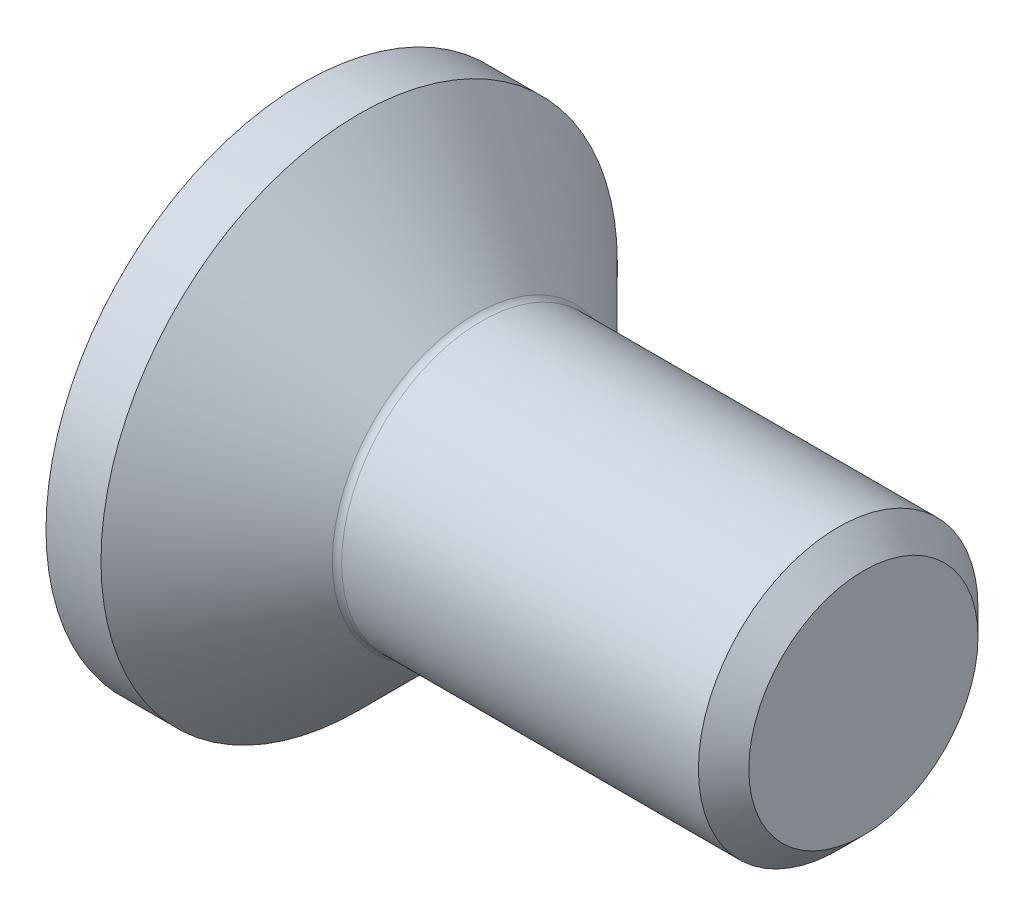
ISO-10303-21;
HEADER;
FILE_DESCRIPTION(('STEP AP214'),'2;1');
FILE_NAME('part.step','',(''),(''),'','','');
FILE_SCHEMA(('AUTOMOTIVE_DESIGN { 1 0 10303 214 1 1 1 1 }'));
ENDSEC;
DATA;
#1=APPLICATION_CONTEXT('core data for automotive mechanical design processes');
#2=APPLICATION_PROTOCOL_DEFINITION('international standard','automotive_design',2000,#1);
#3=PRODUCT_CONTEXT('',#1,'mechanical');
#4=PRODUCT('Part','Part','',(#3));
#5=PRODUCT_RELATED_PRODUCT_CATEGORY('part','',(#4));
#6=PRODUCT_DEFINITION_FORMATION('','',#4);
#7=PRODUCT_DEFINITION_CONTEXT('part definition',#1,'design');
#8=PRODUCT_DEFINITION('design','',#6,#7);
#9=PRODUCT_DEFINITION_SHAPE('','',#8);
#10=(LENGTH_UNIT() NAMED_UNIT(*) SI_UNIT(.MILLI.,.METRE.));
#11=(NAMED_UNIT(*) PLANE_ANGLE_UNIT() SI_UNIT($,.RADIAN.));
#12=(NAMED_UNIT(*) SI_UNIT($,.STERADIAN.) SOLID_ANGLE_UNIT());
#13=UNCERTAINTY_MEASURE_WITH_UNIT(LENGTH_MEASURE(1.E-05),#10,'distance_accuracy_value','');
#14=(GEOMETRIC_REPRESENTATION_CONTEXT(3) GLOBAL_UNCERTAINTY_ASSIGNED_CONTEXT((#13)) GLOBAL_UNIT_ASSIGNED_CONTEXT((#10,
#11,#12)) REPRESENTATION_CONTEXT('',''));
#15=CARTESIAN_POINT('',(0.,0.,0.));
#16=DIRECTION('',(0.,0.,1.));
#17=DIRECTION('',(1.,0.,0.));
#18=AXIS2_PLACEMENT_3D('',#15,#16,#17);
#19=CARTESIAN_POINT('',(6.,1.5,0.));
#20=DIRECTION('',(-1.,0.,0.));
#21=DIRECTION('',(0.,0.,1.));
#22=AXIS2_PLACEMENT_3D('',#19,#20,#21);
#23=PLANE('',#22);
#24=CARTESIAN_POINT('',(6.,0.,0.));
#25=DIRECTION('',(-1.,0.,0.));
#26=DIRECTION('',(0.,0.,1.));
#27=AXIS2_PLACEMENT_3D('',#24,#25,#26);
#28=CIRCLE('',#27,1.2295);
#29=CARTESIAN_POINT('',(6.,0.,1.2295));
#30=VERTEX_POINT('',#29);
#31=EDGE_CURVE('E10',#30,#30,#28,.F.);
#32=ORIENTED_EDGE('',*,*,#31,.T.);
#33=EDGE_LOOP('',(#32));
#34=FACE_BOUND('',#33,.T.);
#35=ADVANCED_FACE('F16',(#34),#23,.F.);
#36=CARTESIAN_POINT('',(-0.587069180985524,0.,0.));
#37=DIRECTION('',(-1.,0.,0.));
#38=DIRECTION('',(0.,0.,1.));
#39=AXIS2_PLACEMENT_3D('',#36,#37,#38);
#40=CYLINDRICAL_SURFACE('',#39,1.5);
#41=CARTESIAN_POINT('',(5.7295,0.,0.));
#42=DIRECTION('',(-1.,0.,0.));
#43=DIRECTION('',(0.,0.,1.));
#44=AXIS2_PLACEMENT_3D('',#41,#42,#43);
#45=CIRCLE('',#44,1.5);
#46=CARTESIAN_POINT('',(5.7295,0.,1.5));
#47=VERTEX_POINT('',#46);
#48=EDGE_CURVE('E25',#47,#47,#45,.T.);
#49=ORIENTED_EDGE('',*,*,#48,.T.);
#50=EDGE_LOOP('',(#49));
#51=FACE_BOUND('',#50,.T.);
#52=CARTESIAN_POINT('',(1.90142135623731,0.,0.));
#53=DIRECTION('',(-1.,0.,0.));
#54=DIRECTION('',(0.,0.,1.));
#55=AXIS2_PLACEMENT_3D('',#52,#53,#54);
#56=CIRCLE('',#55,1.5);
#57=CARTESIAN_POINT('',(1.90142135623731,0.,1.5));
#58=VERTEX_POINT('',#57);
#59=EDGE_CURVE('E133',#58,#58,#56,.F.);
#60=ORIENTED_EDGE('',*,*,#59,.T.);
#61=EDGE_LOOP('',(#60));
#62=FACE_BOUND('',#61,.T.);
#63=ADVANCED_FACE('F109',(#51,#62),#40,.T.);
#64=CARTESIAN_POINT('',(1.86,0.,0.));
#65=DIRECTION('',(-1.,0.,0.));
#66=DIRECTION('',(0.,0.,1.));
#67=AXIS2_PLACEMENT_3D('',#64,#65,#66);
#68=CONICAL_SURFACE('',#67,1.5,0.785398163397448);
#69=CARTESIAN_POINT('',(0.59,0.,0.));
#70=DIRECTION('',(-1.,0.,0.));
#71=DIRECTION('',(0.,0.,1.));
#72=AXIS2_PLACEMENT_3D('',#69,#70,#71);
#73=CIRCLE('',#72,2.77);
#74=CARTESIAN_POINT('',(0.59,0.,2.77));
#75=VERTEX_POINT('',#74);
#76=EDGE_CURVE('E20',#75,#75,#73,.F.);
#77=ORIENTED_EDGE('',*,*,#76,.T.);
#78=EDGE_LOOP('',(#77));
#79=FACE_BOUND('',#78,.T.);
#80=CARTESIAN_POINT('',(1.83071067811866,0.,0.));
#81=DIRECTION('',(-1.,0.,0.));
#82=DIRECTION('',(0.,0.,1.));
#83=AXIS2_PLACEMENT_3D('',#80,#81,#82);
#84=CIRCLE('',#83,1.52928932188135);
#85=CARTESIAN_POINT('',(1.83071067811866,0.,1.52928932188135));
#86=VERTEX_POINT('',#85);
#87=EDGE_CURVE('E136',#86,#86,#84,.T.);
#88=ORIENTED_EDGE('',*,*,#87,.T.);
#89=EDGE_LOOP('',(#88));
#90=FACE_BOUND('',#89,.T.);
#91=ADVANCED_FACE('F116',(#79,#90),#68,.T.);
#92=CARTESIAN_POINT('',(1.90142135623731,0.,0.));
#93=DIRECTION('',(-1.,0.,0.));
#94=DIRECTION('',(0.,0.,1.));
#95=AXIS2_PLACEMENT_3D('',#92,#93,#94);
#96=TOROIDAL_SURFACE('',#95,1.6,0.1);
#97=ORIENTED_EDGE('',*,*,#59,.F.);
#98=EDGE_LOOP('',(#97));
#99=FACE_BOUND('',#98,.T.);
#100=ORIENTED_EDGE('',*,*,#87,.F.);
#101=EDGE_LOOP('',(#100));
#102=FACE_BOUND('',#101,.T.);
#103=ADVANCED_FACE('F120',(#99,#102),#96,.F.);
#104=CARTESIAN_POINT('',(5.7295,0.,0.));
#105=DIRECTION('',(-1.,0.,0.));
#106=DIRECTION('',(0.,0.,1.));
#107=AXIS2_PLACEMENT_3D('',#104,#105,#106);
#108=CONICAL_SURFACE('',#107,1.5,0.78539816339745);
#109=ORIENTED_EDGE('',*,*,#31,.F.);
#110=EDGE_LOOP('',(#109));
#111=FACE_BOUND('',#110,.T.);
#112=ORIENTED_EDGE('',*,*,#48,.F.);
#113=EDGE_LOOP('',(#112));
#114=FACE_BOUND('',#113,.T.);
#115=ADVANCED_FACE('F18',(#111,#114),#108,.T.);
#116=CARTESIAN_POINT('',(11.8531386861314,0.,0.));
#117=DIRECTION('',(1.,0.,0.));
#118=DIRECTION('',(0.,0.,-1.));
#119=AXIS2_PLACEMENT_3D('',#116,#117,#118);
#120=CYLINDRICAL_SURFACE('',#119,2.77);
#121=ORIENTED_EDGE('',*,*,#76,.F.);
#122=EDGE_LOOP('',(#121));
#123=FACE_BOUND('',#122,.T.);
#124=CARTESIAN_POINT('',(0.,0.,0.));
#125=DIRECTION('',(1.,0.,0.));
#126=DIRECTION('',(0.,0.,-1.));
#127=AXIS2_PLACEMENT_3D('',#124,#125,#126);
#128=CIRCLE('',#127,2.77);
#129=CARTESIAN_POINT('',(0.,0.,-2.77));
#130=VERTEX_POINT('',#129);
#131=EDGE_CURVE('E203',#130,#130,#128,.F.);
#132=ORIENTED_EDGE('',*,*,#131,.F.);
#133=EDGE_LOOP('',(#132));
#134=FACE_BOUND('',#133,.T.);
#135=ADVANCED_FACE('F94',(#123,#134),#120,.T.);
#136=CARTESIAN_POINT('',(1.67735026918963,0.,0.));
#137=DIRECTION('',(-1.,0.,0.));
#138=DIRECTION('',(0.,0.,1.));
#139=AXIS2_PLACEMENT_3D('',#136,#137,#138);
#140=CONICAL_SURFACE('',#139,0.,1.0471975511966);
#141=CARTESIAN_POINT('',(1.1,0.,0.));
#142=DIRECTION('',(-1.,0.,0.));
#143=DIRECTION('',(0.,0.,1.));
#144=AXIS2_PLACEMENT_3D('',#141,#142,#143);
#145=CIRCLE('',#144,1.);
#146=CARTESIAN_POINT('',(1.1,0.5,0.866025403784439));
#147=VERTEX_POINT('',#146);
#148=CARTESIAN_POINT('',(1.1,1.,0.));
#149=VERTEX_POINT('',#148);
#150=EDGE_CURVE('E143',#147,#149,#145,.T.);
#151=ORIENTED_EDGE('',*,*,#150,.T.);
#152=CARTESIAN_POINT('',(1.1,0.5,-0.866025403784439));
#153=VERTEX_POINT('',#152);
#154=EDGE_CURVE('E138',#149,#153,#145,.T.);
#155=ORIENTED_EDGE('',*,*,#154,.T.);
#156=CARTESIAN_POINT('',(1.1,-0.5,-0.866025403784439));
#157=VERTEX_POINT('',#156);
#158=EDGE_CURVE('E141',#153,#157,#145,.T.);
#159=ORIENTED_EDGE('',*,*,#158,.T.);
#160=CARTESIAN_POINT('',(1.1,-1.,0.));
#161=VERTEX_POINT('',#160);
#162=EDGE_CURVE('E229',#157,#161,#145,.T.);
#163=ORIENTED_EDGE('',*,*,#162,.T.);
#164=CARTESIAN_POINT('',(1.1,-0.5,0.866025403784438));
#165=VERTEX_POINT('',#164);
#166=EDGE_CURVE('E32',#161,#165,#145,.T.);
#167=ORIENTED_EDGE('',*,*,#166,.T.);
#168=EDGE_CURVE('E152',#165,#147,#145,.T.);
#169=ORIENTED_EDGE('',*,*,#168,.T.);
#170=EDGE_LOOP('',(#151,#155,#159,#163,#167,#169));
#171=FACE_BOUND('',#170,.T.);
#172=CARTESIAN_POINT('',(1.67735026918963,0.,0.));
#173=VERTEX_POINT('',#172);
#174=VERTEX_LOOP('',#173);
#175=FACE_BOUND('',#174,.T.);
#176=ADVANCED_FACE('F91',(#171,#175),#140,.F.);
#177=CARTESIAN_POINT('',(1.1,0.,-1.15470053837925));
#178=DIRECTION('',(1.,0.,0.));
#179=DIRECTION('',(0.,0.,-1.));
#180=AXIS2_PLACEMENT_3D('',#177,#178,#179);
#181=PLANE('',#180);
#182=ORIENTED_EDGE('',*,*,#166,.F.);
#183=DIRECTION('',(0.,0.,-1.));
#184=VECTOR('',#183,1.);
#185=CARTESIAN_POINT('',(1.1,-1.,0.577350269189626));
#186=LINE('',#185,#184);
#187=CARTESIAN_POINT('',(1.1,-1.,0.577350269189626));
#188=VERTEX_POINT('',#187);
#189=EDGE_CURVE('E163',#188,#161,#186,.T.);
#190=ORIENTED_EDGE('',*,*,#189,.F.);
#191=DIRECTION('',(0.,-0.866025403784439,-0.5));
#192=VECTOR('',#191,1.);
#193=CARTESIAN_POINT('',(1.1,0.,1.15470053837925));
#194=LINE('',#193,#192);
#195=EDGE_CURVE('E187',#165,#188,#194,.T.);
#196=ORIENTED_EDGE('',*,*,#195,.F.);
#197=EDGE_LOOP('',(#182,#190,#196));
#198=FACE_BOUND('',#197,.T.);
#199=ADVANCED_FACE('F93',(#198),#181,.F.);
#200=ORIENTED_EDGE('',*,*,#168,.F.);
#201=CARTESIAN_POINT('',(1.1,0.,1.15470053837925));
#202=VERTEX_POINT('',#201);
#203=EDGE_CURVE('E184',#202,#165,#194,.T.);
#204=ORIENTED_EDGE('',*,*,#203,.F.);
#205=DIRECTION('',(0.,-0.866025403784439,0.5));
#206=VECTOR('',#205,1.);
#207=CARTESIAN_POINT('',(1.1,1.,0.577350269189626));
#208=LINE('',#207,#206);
#209=EDGE_CURVE('E191',#147,#202,#208,.T.);
#210=ORIENTED_EDGE('',*,*,#209,.F.);
#211=EDGE_LOOP('',(#200,#204,#210));
#212=FACE_BOUND('',#211,.T.);
#213=ADVANCED_FACE('F102',(#212),#181,.F.);
#214=ORIENTED_EDGE('',*,*,#150,.F.);
#215=CARTESIAN_POINT('',(1.1,1.,0.577350269189626));
#216=VERTEX_POINT('',#215);
#217=EDGE_CURVE('E188',#216,#147,#208,.T.);
#218=ORIENTED_EDGE('',*,*,#217,.F.);
#219=DIRECTION('',(0.,0.,1.));
#220=VECTOR('',#219,1.);
#221=CARTESIAN_POINT('',(1.1,1.,-0.577350269189625));
#222=LINE('',#221,#220);
#223=EDGE_CURVE('E195',#149,#216,#222,.T.);
#224=ORIENTED_EDGE('',*,*,#223,.F.);
#225=EDGE_LOOP('',(#214,#218,#224));
#226=FACE_BOUND('',#225,.T.);
#227=ADVANCED_FACE('F260',(#226),#181,.F.);
#228=ORIENTED_EDGE('',*,*,#154,.F.);
#229=CARTESIAN_POINT('',(1.1,1.,-0.577350269189625));
#230=VERTEX_POINT('',#229);
#231=EDGE_CURVE('E192',#230,#149,#222,.T.);
#232=ORIENTED_EDGE('',*,*,#231,.F.);
#233=DIRECTION('',(0.,0.866025403784439,0.5));
#234=VECTOR('',#233,1.);
#235=CARTESIAN_POINT('',(1.1,0.,-1.15470053837925));
#236=LINE('',#235,#234);
#237=EDGE_CURVE('E199',#153,#230,#236,.T.);
#238=ORIENTED_EDGE('',*,*,#237,.F.);
#239=EDGE_LOOP('',(#228,#232,#238));
#240=FACE_BOUND('',#239,.T.);
#241=ADVANCED_FACE('F266',(#240),#181,.F.);
#242=ORIENTED_EDGE('',*,*,#158,.F.);
#243=CARTESIAN_POINT('',(1.1,0.,-1.15470053837925));
#244=VERTEX_POINT('',#243);
#245=EDGE_CURVE('E196',#244,#153,#236,.T.);
#246=ORIENTED_EDGE('',*,*,#245,.F.);
#247=DIRECTION('',(0.,0.866025403784439,-0.5));
#248=VECTOR('',#247,1.);
#249=CARTESIAN_POINT('',(1.1,-1.,-0.577350269189627));
#250=LINE('',#249,#248);
#251=EDGE_CURVE('E167',#157,#244,#250,.T.);
#252=ORIENTED_EDGE('',*,*,#251,.F.);
#253=EDGE_LOOP('',(#242,#246,#252));
#254=FACE_BOUND('',#253,.T.);
#255=ADVANCED_FACE('F234',(#254),#181,.F.);
#256=ORIENTED_EDGE('',*,*,#162,.F.);
#257=CARTESIAN_POINT('',(1.1,-1.,-0.577350269189627));
#258=VERTEX_POINT('',#257);
#259=EDGE_CURVE('E200',#258,#157,#250,.T.);
#260=ORIENTED_EDGE('',*,*,#259,.F.);
#261=EDGE_CURVE('E183',#161,#258,#186,.T.);
#262=ORIENTED_EDGE('',*,*,#261,.F.);
#263=EDGE_LOOP('',(#256,#260,#262));
#264=FACE_BOUND('',#263,.T.);
#265=ADVANCED_FACE('F105',(#264),#181,.F.);
#266=CARTESIAN_POINT('',(1.1,-1.,0.577350269189626));
#267=DIRECTION('',(0.,1.,0.));
#268=DIRECTION('',(0.,0.,1.));
#269=AXIS2_PLACEMENT_3D('',#266,#267,#268);
#270=PLANE('',#269);
#271=DIRECTION('',(0.,0.,-1.));
#272=VECTOR('',#271,1.);
#273=CARTESIAN_POINT('',(0.,-1.,0.577350269189626));
#274=LINE('',#273,#272);
#275=CARTESIAN_POINT('',(0.,-1.,0.577350269189626));
#276=VERTEX_POINT('',#275);
#277=CARTESIAN_POINT('',(0.,-1.,-0.577350269189627));
#278=VERTEX_POINT('',#277);
#279=EDGE_CURVE('E164',#276,#278,#274,.T.);
#280=ORIENTED_EDGE('',*,*,#279,.F.);
#281=DIRECTION('',(-1.,0.,0.));
#282=VECTOR('',#281,1.);
#283=CARTESIAN_POINT('',(1.1,-1.,0.577350269189626));
#284=LINE('',#283,#282);
#285=EDGE_CURVE('E159',#188,#276,#284,.T.);
#286=ORIENTED_EDGE('',*,*,#285,.F.);
#287=ORIENTED_EDGE('',*,*,#189,.T.);
#288=ORIENTED_EDGE('',*,*,#261,.T.);
#289=DIRECTION('',(-1.,0.,0.));
#290=VECTOR('',#289,1.);
#291=CARTESIAN_POINT('',(1.1,-1.,-0.577350269189627));
#292=LINE('',#291,#290);
#293=EDGE_CURVE('E161',#258,#278,#292,.T.);
#294=ORIENTED_EDGE('',*,*,#293,.T.);
#295=EDGE_LOOP('',(#280,#286,#287,#288,#294));
#296=FACE_BOUND('',#295,.T.);
#297=ADVANCED_FACE('F223',(#296),#270,.T.);
#298=CARTESIAN_POINT('',(1.1,0.,1.15470053837925));
#299=DIRECTION('',(0.,0.5,-0.866025403784439));
#300=DIRECTION('',(0.,0.866025403784439,0.5));
#301=AXIS2_PLACEMENT_3D('',#298,#299,#300);
#302=PLANE('',#301);
#303=DIRECTION('',(0.,-0.866025403784439,-0.5));
#304=VECTOR('',#303,1.);
#305=CARTESIAN_POINT('',(0.,0.,1.15470053837925));
#306=LINE('',#305,#304);
#307=CARTESIAN_POINT('',(0.,0.,1.15470053837925));
#308=VERTEX_POINT('',#307);
#309=EDGE_CURVE('E168',#308,#276,#306,.T.);
#310=ORIENTED_EDGE('',*,*,#309,.F.);
#311=DIRECTION('',(-1.,0.,0.));
#312=VECTOR('',#311,1.);
#313=CARTESIAN_POINT('',(1.1,0.,1.15470053837925));
#314=LINE('',#313,#312);
#315=EDGE_CURVE('E157',#202,#308,#314,.T.);
#316=ORIENTED_EDGE('',*,*,#315,.F.);
#317=ORIENTED_EDGE('',*,*,#203,.T.);
#318=ORIENTED_EDGE('',*,*,#195,.T.);
#319=ORIENTED_EDGE('',*,*,#285,.T.);
#320=EDGE_LOOP('',(#310,#316,#317,#318,#319));
#321=FACE_BOUND('',#320,.T.);
#322=ADVANCED_FACE('F253',(#321),#302,.T.);
#323=CARTESIAN_POINT('',(1.1,1.,0.577350269189626));
#324=DIRECTION('',(0.,-0.5,-0.866025403784439));
#325=DIRECTION('',(0.,0.866025403784439,-0.5));
#326=AXIS2_PLACEMENT_3D('',#323,#324,#325);
#327=PLANE('',#326);
#328=DIRECTION('',(0.,-0.866025403784439,0.5));
#329=VECTOR('',#328,1.);
#330=CARTESIAN_POINT('',(0.,1.,0.577350269189626));
#331=LINE('',#330,#329);
#332=CARTESIAN_POINT('',(0.,1.,0.577350269189626));
#333=VERTEX_POINT('',#332);
#334=EDGE_CURVE('E171',#333,#308,#331,.T.);
#335=ORIENTED_EDGE('',*,*,#334,.F.);
#336=DIRECTION('',(-1.,0.,0.));
#337=VECTOR('',#336,1.);
#338=CARTESIAN_POINT('',(1.1,1.,0.577350269189626));
#339=LINE('',#338,#337);
#340=EDGE_CURVE('E155',#216,#333,#339,.T.);
#341=ORIENTED_EDGE('',*,*,#340,.F.);
#342=ORIENTED_EDGE('',*,*,#217,.T.);
#343=ORIENTED_EDGE('',*,*,#209,.T.);
#344=ORIENTED_EDGE('',*,*,#315,.T.);
#345=EDGE_LOOP('',(#335,#341,#342,#343,#344));
#346=FACE_BOUND('',#345,.T.);
#347=ADVANCED_FACE('F247',(#346),#327,.T.);
#348=CARTESIAN_POINT('',(1.1,1.,-0.577350269189625));
#349=DIRECTION('',(0.,-1.,0.));
#350=DIRECTION('',(0.,0.,-1.));
#351=AXIS2_PLACEMENT_3D('',#348,#349,#350);
#352=PLANE('',#351);
#353=DIRECTION('',(0.,0.,1.));
#354=VECTOR('',#353,1.);
#355=CARTESIAN_POINT('',(0.,1.,-0.577350269189625));
#356=LINE('',#355,#354);
#357=CARTESIAN_POINT('',(0.,1.,-0.577350269189625));
#358=VERTEX_POINT('',#357);
#359=EDGE_CURVE('E174',#358,#333,#356,.T.);
#360=ORIENTED_EDGE('',*,*,#359,.F.);
#361=DIRECTION('',(-1.,0.,0.));
#362=VECTOR('',#361,1.);
#363=CARTESIAN_POINT('',(1.1,1.,-0.577350269189625));
#364=LINE('',#363,#362);
#365=EDGE_CURVE('E153',#230,#358,#364,.T.);
#366=ORIENTED_EDGE('',*,*,#365,.F.);
#367=ORIENTED_EDGE('',*,*,#231,.T.);
#368=ORIENTED_EDGE('',*,*,#223,.T.);
#369=ORIENTED_EDGE('',*,*,#340,.T.);
#370=EDGE_LOOP('',(#360,#366,#367,#368,#369));
#371=FACE_BOUND('',#370,.T.);
#372=ADVANCED_FACE('F243',(#371),#352,.T.);
#373=CARTESIAN_POINT('',(1.1,0.,-1.15470053837925));
#374=DIRECTION('',(0.,-0.5,0.866025403784439));
#375=DIRECTION('',(0.,-0.866025403784439,-0.5));
#376=AXIS2_PLACEMENT_3D('',#373,#374,#375);
#377=PLANE('',#376);
#378=DIRECTION('',(0.,0.866025403784439,0.5));
#379=VECTOR('',#378,1.);
#380=CARTESIAN_POINT('',(0.,0.,-1.15470053837925));
#381=LINE('',#380,#379);
#382=CARTESIAN_POINT('',(0.,0.,-1.15470053837925));
#383=VERTEX_POINT('',#382);
#384=EDGE_CURVE('E177',#383,#358,#381,.T.);
#385=ORIENTED_EDGE('',*,*,#384,.F.);
#386=DIRECTION('',(-1.,0.,0.));
#387=VECTOR('',#386,1.);
#388=CARTESIAN_POINT('',(1.1,0.,-1.15470053837925));
#389=LINE('',#388,#387);
#390=EDGE_CURVE('E145',#244,#383,#389,.T.);
#391=ORIENTED_EDGE('',*,*,#390,.F.);
#392=ORIENTED_EDGE('',*,*,#245,.T.);
#393=ORIENTED_EDGE('',*,*,#237,.T.);
#394=ORIENTED_EDGE('',*,*,#365,.T.);
#395=EDGE_LOOP('',(#385,#391,#392,#393,#394));
#396=FACE_BOUND('',#395,.T.);
#397=ADVANCED_FACE('F238',(#396),#377,.T.);
#398=CARTESIAN_POINT('',(1.1,-1.,-0.577350269189627));
#399=DIRECTION('',(0.,0.5,0.866025403784439));
#400=DIRECTION('',(0.,-0.866025403784439,0.5));
#401=AXIS2_PLACEMENT_3D('',#398,#399,#400);
#402=PLANE('',#401);
#403=DIRECTION('',(0.,0.866025403784439,-0.5));
#404=VECTOR('',#403,1.);
#405=CARTESIAN_POINT('',(0.,-1.,-0.577350269189627));
#406=LINE('',#405,#404);
#407=EDGE_CURVE('E40',#278,#383,#406,.T.);
#408=ORIENTED_EDGE('',*,*,#407,.F.);
#409=ORIENTED_EDGE('',*,*,#293,.F.);
#410=ORIENTED_EDGE('',*,*,#259,.T.);
#411=ORIENTED_EDGE('',*,*,#251,.T.);
#412=ORIENTED_EDGE('',*,*,#390,.T.);
#413=EDGE_LOOP('',(#408,#409,#410,#411,#412));
#414=FACE_BOUND('',#413,.T.);
#415=ADVANCED_FACE('F217',(#414),#402,.T.);
#416=CARTESIAN_POINT('',(0.,0.,0.));
#417=DIRECTION('',(1.,0.,0.));
#418=DIRECTION('',(0.,0.,-1.));
#419=AXIS2_PLACEMENT_3D('',#416,#417,#418);
#420=PLANE('',#419);
#421=ORIENTED_EDGE('',*,*,#131,.T.);
#422=EDGE_LOOP('',(#421));
#423=FACE_BOUND('',#422,.T.);
#424=ORIENTED_EDGE('',*,*,#407,.T.);
#425=ORIENTED_EDGE('',*,*,#384,.T.);
#426=ORIENTED_EDGE('',*,*,#359,.T.);
#427=ORIENTED_EDGE('',*,*,#334,.T.);
#428=ORIENTED_EDGE('',*,*,#309,.T.);
#429=ORIENTED_EDGE('',*,*,#279,.T.);
#430=EDGE_LOOP('',(#424,#425,#426,#427,#428,#429));
#431=FACE_BOUND('',#430,.T.);
#432=ADVANCED_FACE('F214',(#423,#431),#420,.F.);
#433=CLOSED_SHELL('',(#35,#63,#91,#103,#115,#135,#176,#199,#213,#227,#241,#255,#265,#297,#322,
#347,#372,#397,#415,#432));
#434=MANIFOLD_SOLID_BREP('B1',#433);
#435=ADVANCED_BREP_SHAPE_REPRESENTATION('',(#18,#434),#14);
#436=SHAPE_DEFINITION_REPRESENTATION(#9,#435);
ENDSEC;
END-ISO-10303-21;
